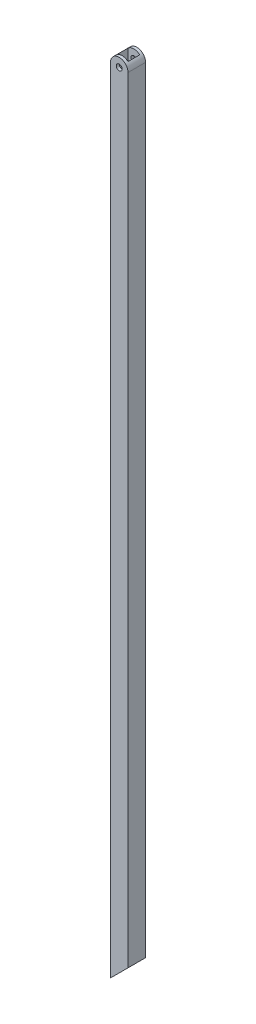
ISO-10303-21;
HEADER;
FILE_DESCRIPTION(('STEP AP214'),'2;1');
FILE_NAME('part.step','',(''),(''),'','','');
FILE_SCHEMA(('AUTOMOTIVE_DESIGN { 1 0 10303 214 1 1 1 1 }'));
ENDSEC;
DATA;
#1=APPLICATION_CONTEXT('core data for automotive mechanical design processes');
#2=APPLICATION_PROTOCOL_DEFINITION('international standard','automotive_design',2000,#1);
#3=PRODUCT_CONTEXT('',#1,'mechanical');
#4=PRODUCT('Part','Part','',(#3));
#5=PRODUCT_RELATED_PRODUCT_CATEGORY('part','',(#4));
#6=PRODUCT_DEFINITION_FORMATION('','',#4);
#7=PRODUCT_DEFINITION_CONTEXT('part definition',#1,'design');
#8=PRODUCT_DEFINITION('design','',#6,#7);
#9=PRODUCT_DEFINITION_SHAPE('','',#8);
#10=(LENGTH_UNIT() NAMED_UNIT(*) SI_UNIT(.MILLI.,.METRE.));
#11=(NAMED_UNIT(*) PLANE_ANGLE_UNIT() SI_UNIT($,.RADIAN.));
#12=(NAMED_UNIT(*) SI_UNIT($,.STERADIAN.) SOLID_ANGLE_UNIT());
#13=UNCERTAINTY_MEASURE_WITH_UNIT(LENGTH_MEASURE(1.E-05),#10,'distance_accuracy_value','');
#14=(GEOMETRIC_REPRESENTATION_CONTEXT(3) GLOBAL_UNCERTAINTY_ASSIGNED_CONTEXT((#13)) GLOBAL_UNIT_ASSIGNED_CONTEXT((#10,
#11,#12)) REPRESENTATION_CONTEXT('',''));
#15=CARTESIAN_POINT('',(0.,0.,0.));
#16=DIRECTION('',(0.,0.,1.));
#17=DIRECTION('',(1.,0.,0.));
#18=AXIS2_PLACEMENT_3D('',#15,#16,#17);
#19=CARTESIAN_POINT('',(0.,0.,19.05));
#20=DIRECTION('',(-0.707106781186549,0.707106781186546,0.));
#21=DIRECTION('',(-0.707106781186546,-0.707106781186549,0.));
#22=AXIS2_PLACEMENT_3D('',#19,#20,#21);
#23=PLANE('',#22);
#24=DIRECTION('',(0.707106781186546,0.707106781186549,0.));
#25=VECTOR('',#24,1.);
#26=CARTESIAN_POINT('',(0.,0.,0.));
#27=LINE('',#26,#25);
#28=CARTESIAN_POINT('',(0.,0.,0.));
#29=VERTEX_POINT('',#28);
#30=CARTESIAN_POINT('',(19.05,19.0500000000001,0.));
#31=VERTEX_POINT('',#30);
#32=EDGE_CURVE('E148',#29,#31,#27,.T.);
#33=ORIENTED_EDGE('',*,*,#32,.T.);
#34=DIRECTION('',(0.,0.,-1.));
#35=VECTOR('',#34,1.);
#36=CARTESIAN_POINT('',(19.05,19.0500000000001,19.05));
#37=LINE('',#36,#35);
#38=CARTESIAN_POINT('',(19.05,19.0500000000001,19.05));
#39=VERTEX_POINT('',#38);
#40=EDGE_CURVE('E129',#39,#31,#37,.T.);
#41=ORIENTED_EDGE('',*,*,#40,.F.);
#42=DIRECTION('',(0.707106781186546,0.707106781186549,0.));
#43=VECTOR('',#42,1.);
#44=CARTESIAN_POINT('',(0.,0.,19.05));
#45=LINE('',#44,#43);
#46=CARTESIAN_POINT('',(0.,0.,19.05));
#47=VERTEX_POINT('',#46);
#48=EDGE_CURVE('E87',#47,#39,#45,.T.);
#49=ORIENTED_EDGE('',*,*,#48,.F.);
#50=DIRECTION('',(0.,0.,-1.));
#51=VECTOR('',#50,1.);
#52=CARTESIAN_POINT('',(0.,0.,19.05));
#53=LINE('',#52,#51);
#54=EDGE_CURVE('E128',#47,#29,#53,.T.);
#55=ORIENTED_EDGE('',*,*,#54,.T.);
#56=EDGE_LOOP('',(#33,#41,#49,#55));
#57=FACE_BOUND('',#56,.T.);
#58=DIRECTION('',(0.,0.,-1.));
#59=VECTOR('',#58,1.);
#60=CARTESIAN_POINT('',(3.175,3.17500000000001,19.05));
#61=LINE('',#60,#59);
#62=CARTESIAN_POINT('',(3.17500000000004,3.17500000000012,15.875));
#63=VERTEX_POINT('',#62);
#64=CARTESIAN_POINT('',(3.175,3.17500000000001,3.175));
#65=VERTEX_POINT('',#64);
#66=EDGE_CURVE('E122',#63,#65,#61,.T.);
#67=ORIENTED_EDGE('',*,*,#66,.F.);
#68=DIRECTION('',(-0.707106781186546,-0.707106781186549,0.));
#69=VECTOR('',#68,1.);
#70=CARTESIAN_POINT('',(0.,0.,15.875));
#71=LINE('',#70,#69);
#72=CARTESIAN_POINT('',(15.875,15.8750000000003,15.875));
#73=VERTEX_POINT('',#72);
#74=EDGE_CURVE('E167',#73,#63,#71,.T.);
#75=ORIENTED_EDGE('',*,*,#74,.F.);
#76=DIRECTION('',(0.,0.,1.));
#77=VECTOR('',#76,1.);
#78=CARTESIAN_POINT('',(15.875,15.8750000000001,19.05));
#79=LINE('',#78,#77);
#80=CARTESIAN_POINT('',(15.8749999999999,15.8749999999997,3.175));
#81=VERTEX_POINT('',#80);
#82=EDGE_CURVE('E165',#81,#73,#79,.T.);
#83=ORIENTED_EDGE('',*,*,#82,.F.);
#84=DIRECTION('',(0.707106781186546,0.707106781186549,0.));
#85=VECTOR('',#84,1.);
#86=CARTESIAN_POINT('',(0.,0.,3.175));
#87=LINE('',#86,#85);
#88=EDGE_CURVE('E114',#65,#81,#87,.T.);
#89=ORIENTED_EDGE('',*,*,#88,.F.);
#90=EDGE_LOOP('',(#67,#75,#83,#89));
#91=FACE_BOUND('',#90,.T.);
#92=ADVANCED_FACE('F34',(#57,#91),#23,.F.);
#93=CARTESIAN_POINT('',(9.525,860.475,19.05));
#94=DIRECTION('',(0.,0.,-1.));
#95=DIRECTION('',(-1.,0.,0.));
#96=AXIS2_PLACEMENT_3D('',#93,#94,#95);
#97=CYLINDRICAL_SURFACE('',#96,9.525);
#98=CARTESIAN_POINT('',(9.525,860.475,0.));
#99=DIRECTION('',(0.,0.,1.));
#100=DIRECTION('',(1.,0.,0.));
#101=AXIS2_PLACEMENT_3D('',#98,#99,#100);
#102=CIRCLE('',#101,9.525);
#103=CARTESIAN_POINT('',(19.05,860.475,0.));
#104=VERTEX_POINT('',#103);
#105=CARTESIAN_POINT('',(0.,860.475,0.));
#106=VERTEX_POINT('',#105);
#107=EDGE_CURVE('E79',#104,#106,#102,.T.);
#108=ORIENTED_EDGE('',*,*,#107,.T.);
#109=DIRECTION('',(0.,0.,-1.));
#110=VECTOR('',#109,1.);
#111=CARTESIAN_POINT('',(0.,860.475,19.05));
#112=LINE('',#111,#110);
#113=CARTESIAN_POINT('',(0.,860.475,19.05));
#114=VERTEX_POINT('',#113);
#115=EDGE_CURVE('E142',#114,#106,#112,.T.);
#116=ORIENTED_EDGE('',*,*,#115,.F.);
#117=CARTESIAN_POINT('',(9.525,860.475,19.05));
#118=DIRECTION('',(0.,0.,1.));
#119=DIRECTION('',(1.,0.,0.));
#120=AXIS2_PLACEMENT_3D('',#117,#118,#119);
#121=CIRCLE('',#120,9.525);
#122=CARTESIAN_POINT('',(19.05,860.475,19.05));
#123=VERTEX_POINT('',#122);
#124=EDGE_CURVE('E58',#123,#114,#121,.T.);
#125=ORIENTED_EDGE('',*,*,#124,.F.);
#126=DIRECTION('',(0.,0.,-1.));
#127=VECTOR('',#126,1.);
#128=CARTESIAN_POINT('',(19.05,860.475,19.05));
#129=LINE('',#128,#127);
#130=EDGE_CURVE('E140',#123,#104,#129,.T.);
#131=ORIENTED_EDGE('',*,*,#130,.T.);
#132=EDGE_LOOP('',(#108,#116,#125,#131));
#133=FACE_BOUND('',#132,.T.);
#134=CARTESIAN_POINT('',(9.525,860.475,3.175));
#135=DIRECTION('',(0.,0.,1.));
#136=DIRECTION('',(1.,0.,0.));
#137=AXIS2_PLACEMENT_3D('',#134,#135,#136);
#138=CIRCLE('',#137,9.525);
#139=CARTESIAN_POINT('',(15.875,867.574515828562,3.175));
#140=VERTEX_POINT('',#139);
#141=CARTESIAN_POINT('',(3.175,867.574515828562,3.175));
#142=VERTEX_POINT('',#141);
#143=EDGE_CURVE('E107',#140,#142,#138,.T.);
#144=ORIENTED_EDGE('',*,*,#143,.F.);
#145=DIRECTION('',(0.,0.,-1.));
#146=VECTOR('',#145,1.);
#147=CARTESIAN_POINT('',(15.875,867.574515828562,19.05));
#148=LINE('',#147,#146);
#149=CARTESIAN_POINT('',(15.875,867.574515828562,15.875));
#150=VERTEX_POINT('',#149);
#151=EDGE_CURVE('E11',#150,#140,#148,.T.);
#152=ORIENTED_EDGE('',*,*,#151,.F.);
#153=CARTESIAN_POINT('',(9.525,860.475,15.875));
#154=DIRECTION('',(0.,0.,-1.));
#155=DIRECTION('',(-1.,0.,0.));
#156=AXIS2_PLACEMENT_3D('',#153,#154,#155);
#157=CIRCLE('',#156,9.525);
#158=CARTESIAN_POINT('',(3.175,867.574515828562,15.875));
#159=VERTEX_POINT('',#158);
#160=EDGE_CURVE('E127',#159,#150,#157,.T.);
#161=ORIENTED_EDGE('',*,*,#160,.F.);
#162=DIRECTION('',(0.,0.,-1.));
#163=VECTOR('',#162,1.);
#164=CARTESIAN_POINT('',(3.175,867.574515828562,19.05));
#165=LINE('',#164,#163);
#166=EDGE_CURVE('E42',#142,#159,#165,.F.);
#167=ORIENTED_EDGE('',*,*,#166,.F.);
#168=EDGE_LOOP('',(#144,#152,#161,#167));
#169=FACE_BOUND('',#168,.T.);
#170=ADVANCED_FACE('F126',(#133,#169),#97,.T.);
#171=CARTESIAN_POINT('',(9.525,860.475,19.05));
#172=DIRECTION('',(0.,0.,-1.));
#173=DIRECTION('',(-1.,0.,0.));
#174=AXIS2_PLACEMENT_3D('',#171,#172,#173);
#175=CYLINDRICAL_SURFACE('',#174,3.175);
#176=CARTESIAN_POINT('',(9.525,860.475,19.05));
#177=DIRECTION('',(0.,0.,1.));
#178=DIRECTION('',(1.,0.,0.));
#179=AXIS2_PLACEMENT_3D('',#176,#177,#178);
#180=CIRCLE('',#179,3.175);
#181=CARTESIAN_POINT('',(6.35,860.475,19.05));
#182=VERTEX_POINT('',#181);
#183=EDGE_CURVE('E153',#182,#182,#180,.T.);
#184=CARTESIAN_POINT('',(9.525,860.475,15.875));
#185=DIRECTION('',(0.,0.,-1.));
#186=DIRECTION('',(-1.,0.,0.));
#187=AXIS2_PLACEMENT_3D('',#184,#185,#186);
#188=CIRCLE('',#187,3.175);
#189=CARTESIAN_POINT('',(6.35,860.475,15.875));
#190=VERTEX_POINT('',#189);
#191=EDGE_CURVE('E132',#190,#190,#188,.T.);
#192=CARTESIAN_POINT('',(6.35,860.475,19.05));
#193=CARTESIAN_POINT('',(6.35,860.475,19.0169270833333));
#194=CARTESIAN_POINT('',(6.35,860.475,18.9838541666667));
#195=CARTESIAN_POINT('',(6.35,860.475,18.9177083333333));
#196=CARTESIAN_POINT('',(6.35,860.475,18.8846354166667));
#197=CARTESIAN_POINT('',(6.35,860.475,18.8184895833333));
#198=CARTESIAN_POINT('',(6.35,860.475,18.7854166666667));
#199=CARTESIAN_POINT('',(6.35,860.475,18.7192708333333));
#200=CARTESIAN_POINT('',(6.35,860.475,18.6861979166667));
#201=CARTESIAN_POINT('',(6.35,860.475,18.6200520833333));
#202=CARTESIAN_POINT('',(6.35,860.475,18.5869791666667));
#203=CARTESIAN_POINT('',(6.35,860.475,18.5208333333333));
#204=CARTESIAN_POINT('',(6.35,860.475,18.4877604166667));
#205=CARTESIAN_POINT('',(6.35,860.475,18.4216145833333));
#206=CARTESIAN_POINT('',(6.35,860.475,18.3885416666667));
#207=CARTESIAN_POINT('',(6.35,860.475,18.3223958333333));
#208=CARTESIAN_POINT('',(6.35,860.475,18.2893229166667));
#209=CARTESIAN_POINT('',(6.35,860.475,18.2231770833333));
#210=CARTESIAN_POINT('',(6.35,860.475,18.1901041666667));
#211=CARTESIAN_POINT('',(6.35,860.475,18.1239583333333));
#212=CARTESIAN_POINT('',(6.35,860.475,18.0908854166667));
#213=CARTESIAN_POINT('',(6.35,860.475,18.0247395833333));
#214=CARTESIAN_POINT('',(6.35,860.475,17.9916666666667));
#215=CARTESIAN_POINT('',(6.35,860.475,17.9255208333333));
#216=CARTESIAN_POINT('',(6.35,860.475,17.8924479166667));
#217=CARTESIAN_POINT('',(6.35,860.475,17.8263020833333));
#218=CARTESIAN_POINT('',(6.35,860.475,17.7932291666667));
#219=CARTESIAN_POINT('',(6.35,860.475,17.7270833333333));
#220=CARTESIAN_POINT('',(6.35,860.475,17.6940104166667));
#221=CARTESIAN_POINT('',(6.35,860.475,17.6278645833333));
#222=CARTESIAN_POINT('',(6.35,860.475,17.5947916666667));
#223=CARTESIAN_POINT('',(6.35,860.475,17.5286458333333));
#224=CARTESIAN_POINT('',(6.35,860.475,17.4955729166667));
#225=CARTESIAN_POINT('',(6.35,860.475,17.4294270833333));
#226=CARTESIAN_POINT('',(6.35,860.475,17.3963541666667));
#227=CARTESIAN_POINT('',(6.35,860.475,17.3302083333333));
#228=CARTESIAN_POINT('',(6.35,860.475,17.2971354166667));
#229=CARTESIAN_POINT('',(6.35,860.475,17.2309895833333));
#230=CARTESIAN_POINT('',(6.35,860.475,17.1979166666667));
#231=CARTESIAN_POINT('',(6.35,860.475,17.1317708333333));
#232=CARTESIAN_POINT('',(6.35,860.475,17.0986979166667));
#233=CARTESIAN_POINT('',(6.35,860.475,17.0325520833333));
#234=CARTESIAN_POINT('',(6.35,860.475,16.9994791666667));
#235=CARTESIAN_POINT('',(6.35,860.475,16.9333333333333));
#236=CARTESIAN_POINT('',(6.35,860.475,16.9002604166667));
#237=CARTESIAN_POINT('',(6.35,860.475,16.8341145833333));
#238=CARTESIAN_POINT('',(6.35,860.475,16.8010416666667));
#239=CARTESIAN_POINT('',(6.35,860.475,16.7348958333333));
#240=CARTESIAN_POINT('',(6.35,860.475,16.7018229166667));
#241=CARTESIAN_POINT('',(6.35,860.475,16.6356770833333));
#242=CARTESIAN_POINT('',(6.35,860.475,16.6026041666667));
#243=CARTESIAN_POINT('',(6.35,860.475,16.5364583333333));
#244=CARTESIAN_POINT('',(6.35,860.475,16.5033854166667));
#245=CARTESIAN_POINT('',(6.35,860.475,16.4372395833333));
#246=CARTESIAN_POINT('',(6.35,860.475,16.4041666666667));
#247=CARTESIAN_POINT('',(6.35,860.475,16.3380208333333));
#248=CARTESIAN_POINT('',(6.35,860.475,16.3049479166667));
#249=CARTESIAN_POINT('',(6.35,860.475,16.2388020833333));
#250=CARTESIAN_POINT('',(6.35,860.475,16.2057291666667));
#251=CARTESIAN_POINT('',(6.35,860.475,16.1395833333333));
#252=CARTESIAN_POINT('',(6.35,860.475,16.1065104166667));
#253=CARTESIAN_POINT('',(6.35,860.475,16.0403645833333));
#254=CARTESIAN_POINT('',(6.35,860.475,16.0072916666667));
#255=CARTESIAN_POINT('',(6.35,860.475,15.9411458333333));
#256=CARTESIAN_POINT('',(6.35,860.475,15.9080729166667));
#257=CARTESIAN_POINT('',(6.35,860.475,15.875));
#258=B_SPLINE_CURVE_WITH_KNOTS('',3,(#192,#193,#194,#195,#196,#197,#198,#199,#200,#201,#202,
#203,#204,#205,#206,#207,#208,#209,#210,#211,#212,#213,#214,#215,#216,#217,#218,#219,#220,#221,
#222,#223,#224,#225,#226,#227,#228,#229,#230,#231,#232,#233,#234,#235,#236,#237,#238,#239,#240,
#241,#242,#243,#244,#245,#246,#247,#248,#249,#250,#251,#252,#253,#254,#255,#256,#257),
.UNSPECIFIED.,.F.,.F.,(4,2,2,2,2,2,2,2,2,2,2,2,2,2,2,2,2,2,2,2,2,2,2,2,2,2,2,2,2,2,2,2,4),(0.,
0.0992187499999977,0.198437499999999,0.297656249999997,0.396874999999998,0.496093749999999,
0.595312499999997,0.694531249999998,0.793749999999996,0.892968749999997,0.992187499999998,
1.09140625,1.190625,1.28984375,1.3890625,1.48828125,1.5875,1.68671875,1.7859375,1.88515625,
1.984375,2.08359374999999,2.1828125,2.28203125,2.38124999999999,2.48046875,2.5796875,
2.67890624999999,2.778125,2.87734375,2.97656249999999,3.07578125,3.17499999999999),.UNSPECIFIED.);
#259=EDGE_CURVE('BSEAM199',#182,#190,#258,.T.);
#260=ORIENTED_EDGE('',*,*,#183,.T.);
#261=ORIENTED_EDGE('',*,*,#191,.T.);
#262=ORIENTED_EDGE('',*,*,#259,.T.);
#263=ORIENTED_EDGE('',*,*,#259,.F.);
#264=EDGE_LOOP('',(#260,#262,#261,#263));
#265=FACE_BOUND('',#264,.T.);
#266=ADVANCED_FACE('F199',(#265),#175,.F.);
#267=CARTESIAN_POINT('',(9.525,860.475,0.));
#268=DIRECTION('',(0.,0.,1.));
#269=DIRECTION('',(1.,0.,0.));
#270=AXIS2_PLACEMENT_3D('',#267,#268,#269);
#271=CIRCLE('',#270,3.175);
#272=CARTESIAN_POINT('',(6.35,860.475,0.));
#273=VERTEX_POINT('',#272);
#274=EDGE_CURVE('E159',#273,#273,#271,.T.);
#275=CARTESIAN_POINT('',(9.525,860.475,3.175));
#276=DIRECTION('',(0.,0.,1.));
#277=DIRECTION('',(1.,0.,0.));
#278=AXIS2_PLACEMENT_3D('',#275,#276,#277);
#279=CIRCLE('',#278,3.175);
#280=CARTESIAN_POINT('',(6.35,860.475,3.175));
#281=VERTEX_POINT('',#280);
#282=EDGE_CURVE('E115',#281,#281,#279,.T.);
#283=CARTESIAN_POINT('',(6.35,860.475,0.));
#284=CARTESIAN_POINT('',(6.35,860.475,0.0330729166666671));
#285=CARTESIAN_POINT('',(6.35,860.475,0.0661458333333342));
#286=CARTESIAN_POINT('',(6.35,860.475,0.132291666666667));
#287=CARTESIAN_POINT('',(6.35,860.475,0.165364583333333));
#288=CARTESIAN_POINT('',(6.35,860.475,0.231510416666666));
#289=CARTESIAN_POINT('',(6.35,860.475,0.264583333333333));
#290=CARTESIAN_POINT('',(6.35,860.475,0.330729166666667));
#291=CARTESIAN_POINT('',(6.35,860.475,0.363802083333334));
#292=CARTESIAN_POINT('',(6.35,860.475,0.429947916666667));
#293=CARTESIAN_POINT('',(6.35,860.475,0.463020833333333));
#294=CARTESIAN_POINT('',(6.35,860.475,0.529166666666666));
#295=CARTESIAN_POINT('',(6.35,860.475,0.562239583333333));
#296=CARTESIAN_POINT('',(6.35,860.475,0.628385416666667));
#297=CARTESIAN_POINT('',(6.35,860.475,0.661458333333334));
#298=CARTESIAN_POINT('',(6.35,860.475,0.727604166666669));
#299=CARTESIAN_POINT('',(6.35,860.475,0.760677083333336));
#300=CARTESIAN_POINT('',(6.35,860.475,0.826822916666669));
#301=CARTESIAN_POINT('',(6.35,860.475,0.859895833333335));
#302=CARTESIAN_POINT('',(6.35,860.475,0.926041666666668));
#303=CARTESIAN_POINT('',(6.35,860.475,0.959114583333335));
#304=CARTESIAN_POINT('',(6.35,860.475,1.02526041666667));
#305=CARTESIAN_POINT('',(6.35,860.475,1.05833333333334));
#306=CARTESIAN_POINT('',(6.35,860.475,1.12447916666667));
#307=CARTESIAN_POINT('',(6.35,860.475,1.15755208333333));
#308=CARTESIAN_POINT('',(6.35,860.475,1.22369791666667));
#309=CARTESIAN_POINT('',(6.35,860.475,1.25677083333333));
#310=CARTESIAN_POINT('',(6.35,860.475,1.32291666666667));
#311=CARTESIAN_POINT('',(6.35,860.475,1.35598958333334));
#312=CARTESIAN_POINT('',(6.35,860.475,1.42213541666667));
#313=CARTESIAN_POINT('',(6.35,860.475,1.45520833333333));
#314=CARTESIAN_POINT('',(6.35,860.475,1.52135416666667));
#315=CARTESIAN_POINT('',(6.35,860.475,1.55442708333333));
#316=CARTESIAN_POINT('',(6.35,860.475,1.62057291666667));
#317=CARTESIAN_POINT('',(6.35,860.475,1.65364583333334));
#318=CARTESIAN_POINT('',(6.35,860.475,1.71979166666667));
#319=CARTESIAN_POINT('',(6.35,860.475,1.75286458333334));
#320=CARTESIAN_POINT('',(6.35,860.475,1.81901041666667));
#321=CARTESIAN_POINT('',(6.35,860.475,1.85208333333334));
#322=CARTESIAN_POINT('',(6.35,860.475,1.91822916666667));
#323=CARTESIAN_POINT('',(6.35,860.475,1.95130208333334));
#324=CARTESIAN_POINT('',(6.35,860.475,2.01744791666667));
#325=CARTESIAN_POINT('',(6.35,860.475,2.05052083333334));
#326=CARTESIAN_POINT('',(6.35,860.475,2.11666666666667));
#327=CARTESIAN_POINT('',(6.35,860.475,2.14973958333334));
#328=CARTESIAN_POINT('',(6.35,860.475,2.21588541666667));
#329=CARTESIAN_POINT('',(6.35,860.475,2.24895833333334));
#330=CARTESIAN_POINT('',(6.35,860.475,2.31510416666667));
#331=CARTESIAN_POINT('',(6.35,860.475,2.34817708333334));
#332=CARTESIAN_POINT('',(6.35,860.475,2.41432291666667));
#333=CARTESIAN_POINT('',(6.35,860.475,2.44739583333334));
#334=CARTESIAN_POINT('',(6.35,860.475,2.51354166666667));
#335=CARTESIAN_POINT('',(6.35,860.475,2.54661458333334));
#336=CARTESIAN_POINT('',(6.35,860.475,2.61276041666667));
#337=CARTESIAN_POINT('',(6.35,860.475,2.64583333333334));
#338=CARTESIAN_POINT('',(6.35,860.475,2.71197916666667));
#339=CARTESIAN_POINT('',(6.35,860.475,2.74505208333334));
#340=CARTESIAN_POINT('',(6.35,860.475,2.81119791666667));
#341=CARTESIAN_POINT('',(6.35,860.475,2.84427083333334));
#342=CARTESIAN_POINT('',(6.35,860.475,2.91041666666667));
#343=CARTESIAN_POINT('',(6.35,860.475,2.94348958333334));
#344=CARTESIAN_POINT('',(6.35,860.475,3.00963541666667));
#345=CARTESIAN_POINT('',(6.35,860.475,3.04270833333334));
#346=CARTESIAN_POINT('',(6.35,860.475,3.10885416666667));
#347=CARTESIAN_POINT('',(6.35,860.475,3.14192708333334));
#348=CARTESIAN_POINT('',(6.35,860.475,3.175));
#349=B_SPLINE_CURVE_WITH_KNOTS('',3,(#283,#284,#285,#286,#287,#288,#289,#290,#291,#292,#293,
#294,#295,#296,#297,#298,#299,#300,#301,#302,#303,#304,#305,#306,#307,#308,#309,#310,#311,#312,
#313,#314,#315,#316,#317,#318,#319,#320,#321,#322,#323,#324,#325,#326,#327,#328,#329,#330,#331,
#332,#333,#334,#335,#336,#337,#338,#339,#340,#341,#342,#343,#344,#345,#346,#347,#348),
.UNSPECIFIED.,.F.,.F.,(4,2,2,2,2,2,2,2,2,2,2,2,2,2,2,2,2,2,2,2,2,2,2,2,2,2,2,2,2,2,2,2,4),(0.,
0.0992187500000012,0.198437499999999,0.29765625,0.396875000000001,0.496093749999999,0.5953125,
0.694531250000002,0.793750000000003,0.892968750000001,0.992187500000002,1.09140625,1.190625,
1.28984375,1.3890625,1.48828125,1.5875,1.68671875,1.7859375,1.88515625,1.984375,2.08359375,
2.1828125,2.28203125,2.38125,2.48046875,2.5796875,2.67890625,2.778125,2.87734375,
2.97656250000001,3.07578125,3.175),.UNSPECIFIED.);
#350=EDGE_CURVE('BSEAM213',#273,#281,#349,.T.);
#351=ORIENTED_EDGE('',*,*,#274,.F.);
#352=ORIENTED_EDGE('',*,*,#282,.T.);
#353=ORIENTED_EDGE('',*,*,#350,.T.);
#354=ORIENTED_EDGE('',*,*,#350,.F.);
#355=EDGE_LOOP('',(#351,#353,#352,#354));
#356=FACE_BOUND('',#355,.T.);
#357=ADVANCED_FACE('F213',(#356),#175,.F.);
#358=CARTESIAN_POINT('',(9.525,860.475,19.05));
#359=DIRECTION('',(0.,0.,1.));
#360=DIRECTION('',(1.,0.,0.));
#361=AXIS2_PLACEMENT_3D('',#358,#359,#360);
#362=PLANE('',#361);
#363=DIRECTION('',(0.,-1.,0.));
#364=VECTOR('',#363,1.);
#365=CARTESIAN_POINT('',(0.,0.,19.05));
#366=LINE('',#365,#364);
#367=EDGE_CURVE('E145',#114,#47,#366,.T.);
#368=ORIENTED_EDGE('',*,*,#367,.T.);
#369=ORIENTED_EDGE('',*,*,#48,.T.);
#370=DIRECTION('',(0.,1.,0.));
#371=VECTOR('',#370,1.);
#372=CARTESIAN_POINT('',(19.05,19.0500000000001,19.05));
#373=LINE('',#372,#371);
#374=EDGE_CURVE('E155',#39,#123,#373,.T.);
#375=ORIENTED_EDGE('',*,*,#374,.T.);
#376=ORIENTED_EDGE('',*,*,#124,.T.);
#377=EDGE_LOOP('',(#368,#369,#375,#376));
#378=FACE_BOUND('',#377,.T.);
#379=ORIENTED_EDGE('',*,*,#183,.F.);
#380=EDGE_LOOP('',(#379));
#381=FACE_BOUND('',#380,.T.);
#382=ADVANCED_FACE('F209',(#378,#381),#362,.T.);
#383=CARTESIAN_POINT('',(9.525,860.475,0.));
#384=DIRECTION('',(0.,0.,1.));
#385=DIRECTION('',(1.,0.,0.));
#386=AXIS2_PLACEMENT_3D('',#383,#384,#385);
#387=PLANE('',#386);
#388=DIRECTION('',(0.,-1.,0.));
#389=VECTOR('',#388,1.);
#390=CARTESIAN_POINT('',(0.,0.,0.));
#391=LINE('',#390,#389);
#392=EDGE_CURVE('E150',#106,#29,#391,.T.);
#393=ORIENTED_EDGE('',*,*,#392,.F.);
#394=ORIENTED_EDGE('',*,*,#107,.F.);
#395=DIRECTION('',(0.,1.,0.));
#396=VECTOR('',#395,1.);
#397=CARTESIAN_POINT('',(19.05,19.0500000000001,0.));
#398=LINE('',#397,#396);
#399=EDGE_CURVE('E146',#31,#104,#398,.T.);
#400=ORIENTED_EDGE('',*,*,#399,.F.);
#401=ORIENTED_EDGE('',*,*,#32,.F.);
#402=EDGE_LOOP('',(#393,#394,#400,#401));
#403=FACE_BOUND('',#402,.T.);
#404=ORIENTED_EDGE('',*,*,#274,.T.);
#405=EDGE_LOOP('',(#404));
#406=FACE_BOUND('',#405,.T.);
#407=ADVANCED_FACE('F206',(#403,#406),#387,.F.);
#408=CARTESIAN_POINT('',(0.,0.,19.05));
#409=DIRECTION('',(1.,0.,0.));
#410=DIRECTION('',(0.,0.,-1.));
#411=AXIS2_PLACEMENT_3D('',#408,#409,#410);
#412=PLANE('',#411);
#413=ORIENTED_EDGE('',*,*,#392,.T.);
#414=ORIENTED_EDGE('',*,*,#54,.F.);
#415=ORIENTED_EDGE('',*,*,#367,.F.);
#416=ORIENTED_EDGE('',*,*,#115,.T.);
#417=EDGE_LOOP('',(#413,#414,#415,#416));
#418=FACE_BOUND('',#417,.T.);
#419=ADVANCED_FACE('F36',(#418),#412,.F.);
#420=CARTESIAN_POINT('',(19.05,19.0500000000001,19.05));
#421=DIRECTION('',(-1.,0.,0.));
#422=DIRECTION('',(0.,-1.,0.));
#423=AXIS2_PLACEMENT_3D('',#420,#421,#422);
#424=PLANE('',#423);
#425=ORIENTED_EDGE('',*,*,#399,.T.);
#426=ORIENTED_EDGE('',*,*,#130,.F.);
#427=ORIENTED_EDGE('',*,*,#374,.F.);
#428=ORIENTED_EDGE('',*,*,#40,.T.);
#429=EDGE_LOOP('',(#425,#426,#427,#428));
#430=FACE_BOUND('',#429,.T.);
#431=ADVANCED_FACE('F202',(#430),#424,.F.);
#432=CARTESIAN_POINT('',(3.175,870.,3.175));
#433=DIRECTION('',(1.,0.,0.));
#434=DIRECTION('',(0.,0.,-1.));
#435=AXIS2_PLACEMENT_3D('',#432,#433,#434);
#436=PLANE('',#435);
#437=ORIENTED_EDGE('',*,*,#66,.T.);
#438=DIRECTION('',(0.,-1.,0.));
#439=VECTOR('',#438,1.);
#440=CARTESIAN_POINT('',(3.175,870.,3.175));
#441=LINE('',#440,#439);
#442=EDGE_CURVE('E49',#142,#65,#441,.T.);
#443=ORIENTED_EDGE('',*,*,#442,.F.);
#444=ORIENTED_EDGE('',*,*,#166,.T.);
#445=DIRECTION('',(0.,-1.,0.));
#446=VECTOR('',#445,1.);
#447=CARTESIAN_POINT('',(3.175,870.,15.875));
#448=LINE('',#447,#446);
#449=EDGE_CURVE('E136',#159,#63,#448,.T.);
#450=ORIENTED_EDGE('',*,*,#449,.T.);
#451=EDGE_LOOP('',(#437,#443,#444,#450));
#452=FACE_BOUND('',#451,.T.);
#453=ADVANCED_FACE('F118',(#452),#436,.T.);
#454=CARTESIAN_POINT('',(15.875,870.,3.175));
#455=DIRECTION('',(-1.,0.,0.));
#456=DIRECTION('',(0.,0.,1.));
#457=AXIS2_PLACEMENT_3D('',#454,#455,#456);
#458=PLANE('',#457);
#459=ORIENTED_EDGE('',*,*,#82,.T.);
#460=DIRECTION('',(0.,-1.,0.));
#461=VECTOR('',#460,1.);
#462=CARTESIAN_POINT('',(15.875,870.,15.875));
#463=LINE('',#462,#461);
#464=EDGE_CURVE('E172',#150,#73,#463,.T.);
#465=ORIENTED_EDGE('',*,*,#464,.F.);
#466=ORIENTED_EDGE('',*,*,#151,.T.);
#467=DIRECTION('',(0.,-1.,0.));
#468=VECTOR('',#467,1.);
#469=CARTESIAN_POINT('',(15.875,870.,3.175));
#470=LINE('',#469,#468);
#471=EDGE_CURVE('E110',#140,#81,#470,.T.);
#472=ORIENTED_EDGE('',*,*,#471,.T.);
#473=EDGE_LOOP('',(#459,#465,#466,#472));
#474=FACE_BOUND('',#473,.T.);
#475=ADVANCED_FACE('F177',(#474),#458,.T.);
#476=CARTESIAN_POINT('',(3.175,870.,15.875));
#477=DIRECTION('',(0.,0.,-1.));
#478=DIRECTION('',(-1.,0.,0.));
#479=AXIS2_PLACEMENT_3D('',#476,#477,#478);
#480=PLANE('',#479);
#481=ORIENTED_EDGE('',*,*,#191,.F.);
#482=EDGE_LOOP('',(#481));
#483=FACE_BOUND('',#482,.T.);
#484=ORIENTED_EDGE('',*,*,#74,.T.);
#485=ORIENTED_EDGE('',*,*,#449,.F.);
#486=ORIENTED_EDGE('',*,*,#160,.T.);
#487=ORIENTED_EDGE('',*,*,#464,.T.);
#488=EDGE_LOOP('',(#484,#485,#486,#487));
#489=FACE_BOUND('',#488,.T.);
#490=ADVANCED_FACE('F182',(#483,#489),#480,.T.);
#491=CARTESIAN_POINT('',(3.175,870.,3.175));
#492=DIRECTION('',(0.,0.,1.));
#493=DIRECTION('',(1.,0.,0.));
#494=AXIS2_PLACEMENT_3D('',#491,#492,#493);
#495=PLANE('',#494);
#496=ORIENTED_EDGE('',*,*,#282,.F.);
#497=EDGE_LOOP('',(#496));
#498=FACE_BOUND('',#497,.T.);
#499=ORIENTED_EDGE('',*,*,#88,.T.);
#500=ORIENTED_EDGE('',*,*,#471,.F.);
#501=ORIENTED_EDGE('',*,*,#143,.T.);
#502=ORIENTED_EDGE('',*,*,#442,.T.);
#503=EDGE_LOOP('',(#499,#500,#501,#502));
#504=FACE_BOUND('',#503,.T.);
#505=ADVANCED_FACE('F108',(#498,#504),#495,.T.);
#506=CLOSED_SHELL('',(#92,#170,#266,#357,#382,#407,#419,#431,#453,#475,#490,#505));
#507=MANIFOLD_SOLID_BREP('B2',#506);
#508=ADVANCED_BREP_SHAPE_REPRESENTATION('',(#18,#507),#14);
#509=SHAPE_DEFINITION_REPRESENTATION(#9,#508);
ENDSEC;
END-ISO-10303-21;
